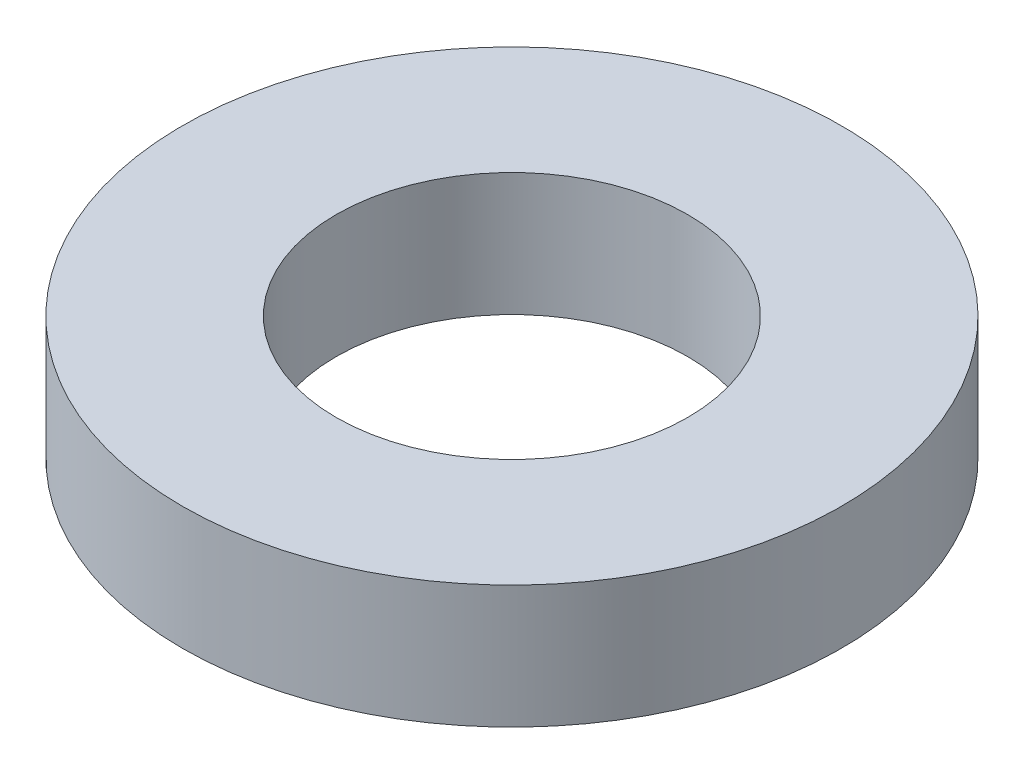
ISO-10303-21;
HEADER;
FILE_DESCRIPTION(('STEP AP214'),'2;1');
FILE_NAME('part.step','',(''),(''),'','','');
FILE_SCHEMA(('AUTOMOTIVE_DESIGN { 1 0 10303 214 1 1 1 1 }'));
ENDSEC;
DATA;
#1=APPLICATION_CONTEXT('core data for automotive mechanical design processes');
#2=APPLICATION_PROTOCOL_DEFINITION('international standard','automotive_design',2000,#1);
#3=PRODUCT_CONTEXT('',#1,'mechanical');
#4=PRODUCT('Part','Part','',(#3));
#5=PRODUCT_RELATED_PRODUCT_CATEGORY('part','',(#4));
#6=PRODUCT_DEFINITION_FORMATION('','',#4);
#7=PRODUCT_DEFINITION_CONTEXT('part definition',#1,'design');
#8=PRODUCT_DEFINITION('design','',#6,#7);
#9=PRODUCT_DEFINITION_SHAPE('','',#8);
#10=(LENGTH_UNIT() NAMED_UNIT(*) SI_UNIT(.MILLI.,.METRE.));
#11=(NAMED_UNIT(*) PLANE_ANGLE_UNIT() SI_UNIT($,.RADIAN.));
#12=(NAMED_UNIT(*) SI_UNIT($,.STERADIAN.) SOLID_ANGLE_UNIT());
#13=UNCERTAINTY_MEASURE_WITH_UNIT(LENGTH_MEASURE(1.E-05),#10,'distance_accuracy_value','');
#14=(GEOMETRIC_REPRESENTATION_CONTEXT(3) GLOBAL_UNCERTAINTY_ASSIGNED_CONTEXT((#13)) GLOBAL_UNIT_ASSIGNED_CONTEXT((#10,
#11,#12)) REPRESENTATION_CONTEXT('',''));
#15=CARTESIAN_POINT('',(0.,0.,0.));
#16=DIRECTION('',(0.,0.,1.));
#17=DIRECTION('',(1.,0.,0.));
#18=AXIS2_PLACEMENT_3D('',#15,#16,#17);
#19=CARTESIAN_POINT('',(0.,2.8,0.));
#20=DIRECTION('',(0.,1.,0.));
#21=DIRECTION('',(0.,0.,1.));
#22=AXIS2_PLACEMENT_3D('',#19,#20,#21);
#23=PLANE('',#22);
#24=CARTESIAN_POINT('',(0.,2.8,0.));
#25=DIRECTION('',(0.,1.,0.));
#26=DIRECTION('',(0.,0.,1.));
#27=AXIS2_PLACEMENT_3D('',#24,#25,#26);
#28=CIRCLE('',#27,7.5);
#29=CARTESIAN_POINT('',(0.,2.8,7.5));
#30=VERTEX_POINT('',#29);
#31=EDGE_CURVE('E10',#30,#30,#28,.T.);
#32=ORIENTED_EDGE('',*,*,#31,.T.);
#33=EDGE_LOOP('',(#32));
#34=FACE_BOUND('',#33,.T.);
#35=CARTESIAN_POINT('',(0.,2.8,0.));
#36=DIRECTION('',(0.,1.,0.));
#37=DIRECTION('',(0.,0.,1.));
#38=AXIS2_PLACEMENT_3D('',#35,#36,#37);
#39=CIRCLE('',#38,4.);
#40=CARTESIAN_POINT('',(0.,2.8,4.));
#41=VERTEX_POINT('',#40);
#42=EDGE_CURVE('E48',#41,#41,#39,.T.);
#43=ORIENTED_EDGE('',*,*,#42,.F.);
#44=EDGE_LOOP('',(#43));
#45=FACE_BOUND('',#44,.T.);
#46=ADVANCED_FACE('F37',(#34,#45),#23,.T.);
#47=CARTESIAN_POINT('',(0.,0.,0.));
#48=DIRECTION('',(0.,1.,0.));
#49=DIRECTION('',(0.,0.,1.));
#50=AXIS2_PLACEMENT_3D('',#47,#48,#49);
#51=PLANE('',#50);
#52=CARTESIAN_POINT('',(0.,0.,0.));
#53=DIRECTION('',(0.,1.,0.));
#54=DIRECTION('',(0.,0.,1.));
#55=AXIS2_PLACEMENT_3D('',#52,#53,#54);
#56=CIRCLE('',#55,7.5);
#57=CARTESIAN_POINT('',(0.,0.,7.5));
#58=VERTEX_POINT('',#57);
#59=EDGE_CURVE('E41',#58,#58,#56,.T.);
#60=ORIENTED_EDGE('',*,*,#59,.F.);
#61=EDGE_LOOP('',(#60));
#62=FACE_BOUND('',#61,.T.);
#63=CARTESIAN_POINT('',(0.,0.,0.));
#64=DIRECTION('',(0.,1.,0.));
#65=DIRECTION('',(0.,0.,1.));
#66=AXIS2_PLACEMENT_3D('',#63,#64,#65);
#67=CIRCLE('',#66,4.);
#68=CARTESIAN_POINT('',(0.,0.,4.));
#69=VERTEX_POINT('',#68);
#70=EDGE_CURVE('E50',#69,#69,#67,.T.);
#71=ORIENTED_EDGE('',*,*,#70,.T.);
#72=EDGE_LOOP('',(#71));
#73=FACE_BOUND('',#72,.T.);
#74=ADVANCED_FACE('F60',(#62,#73),#51,.F.);
#75=CARTESIAN_POINT('',(0.,2.8,0.));
#76=DIRECTION('',(0.,-1.,0.));
#77=DIRECTION('',(0.,0.,-1.));
#78=AXIS2_PLACEMENT_3D('',#75,#76,#77);
#79=CYLINDRICAL_SURFACE('',#78,7.5);
#80=ORIENTED_EDGE('',*,*,#31,.F.);
#81=EDGE_LOOP('',(#80));
#82=FACE_BOUND('',#81,.T.);
#83=ORIENTED_EDGE('',*,*,#59,.T.);
#84=EDGE_LOOP('',(#83));
#85=FACE_BOUND('',#84,.T.);
#86=ADVANCED_FACE('F39',(#82,#85),#79,.T.);
#87=CARTESIAN_POINT('',(0.,2.8,0.));
#88=DIRECTION('',(0.,-1.,0.));
#89=DIRECTION('',(0.,0.,-1.));
#90=AXIS2_PLACEMENT_3D('',#87,#88,#89);
#91=CYLINDRICAL_SURFACE('',#90,4.);
#92=ORIENTED_EDGE('',*,*,#42,.T.);
#93=EDGE_LOOP('',(#92));
#94=FACE_BOUND('',#93,.T.);
#95=ORIENTED_EDGE('',*,*,#70,.F.);
#96=EDGE_LOOP('',(#95));
#97=FACE_BOUND('',#96,.T.);
#98=ADVANCED_FACE('F56',(#94,#97),#91,.F.);
#99=CLOSED_SHELL('',(#46,#74,#86,#98));
#100=MANIFOLD_SOLID_BREP('B2',#99);
#101=ADVANCED_BREP_SHAPE_REPRESENTATION('',(#18,#100),#14);
#102=SHAPE_DEFINITION_REPRESENTATION(#9,#101);
ENDSEC;
END-ISO-10303-21;
